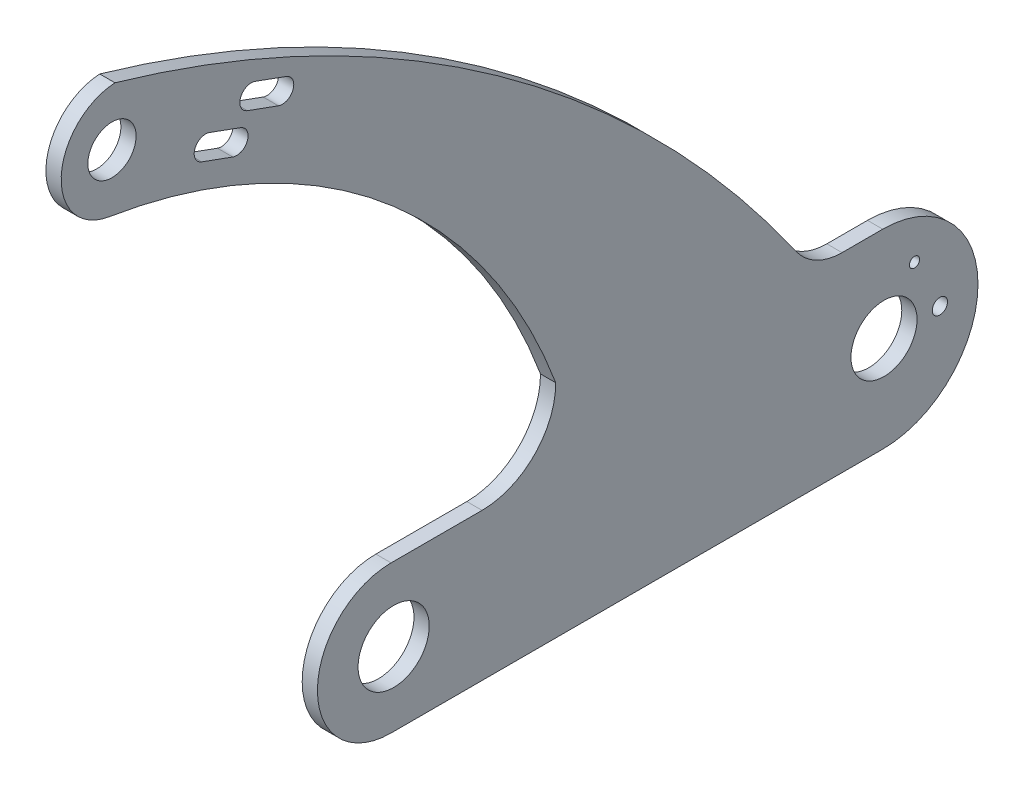
ISO-10303-21;
HEADER;
FILE_DESCRIPTION(('STEP AP214'),'2;1');
FILE_NAME('part.step','',(''),(''),'','','');
FILE_SCHEMA(('AUTOMOTIVE_DESIGN { 1 0 10303 214 1 1 1 1 }'));
ENDSEC;
DATA;
#1=APPLICATION_CONTEXT('core data for automotive mechanical design processes');
#2=APPLICATION_PROTOCOL_DEFINITION('international standard','automotive_design',2000,#1);
#3=PRODUCT_CONTEXT('',#1,'mechanical');
#4=PRODUCT('Part','Part','',(#3));
#5=PRODUCT_RELATED_PRODUCT_CATEGORY('part','',(#4));
#6=PRODUCT_DEFINITION_FORMATION('','',#4);
#7=PRODUCT_DEFINITION_CONTEXT('part definition',#1,'design');
#8=PRODUCT_DEFINITION('design','',#6,#7);
#9=PRODUCT_DEFINITION_SHAPE('','',#8);
#10=(LENGTH_UNIT() NAMED_UNIT(*) SI_UNIT(.MILLI.,.METRE.));
#11=(NAMED_UNIT(*) PLANE_ANGLE_UNIT() SI_UNIT($,.RADIAN.));
#12=(NAMED_UNIT(*) SI_UNIT($,.STERADIAN.) SOLID_ANGLE_UNIT());
#13=UNCERTAINTY_MEASURE_WITH_UNIT(LENGTH_MEASURE(1.E-05),#10,'distance_accuracy_value','');
#14=(GEOMETRIC_REPRESENTATION_CONTEXT(3) GLOBAL_UNCERTAINTY_ASSIGNED_CONTEXT((#13)) GLOBAL_UNIT_ASSIGNED_CONTEXT((#10,
#11,#12)) REPRESENTATION_CONTEXT('',''));
#15=CARTESIAN_POINT('',(0.,0.,0.));
#16=DIRECTION('',(0.,0.,1.));
#17=DIRECTION('',(1.,0.,0.));
#18=AXIS2_PLACEMENT_3D('',#15,#16,#17);
#19=CARTESIAN_POINT('',(3.,14.5,48.375));
#20=DIRECTION('',(-1.,0.,0.));
#21=DIRECTION('',(0.,0.,1.));
#22=AXIS2_PLACEMENT_3D('',#19,#20,#21);
#23=PLANE('',#22);
#24=CARTESIAN_POINT('',(3.,18.75,-48.625));
#25=DIRECTION('',(-1.,0.,0.));
#26=DIRECTION('',(0.,0.,1.));
#27=AXIS2_PLACEMENT_3D('',#24,#25,#26);
#28=CIRCLE('',#27,6.5);
#29=CARTESIAN_POINT('',(3.,18.75,-42.125));
#30=VERTEX_POINT('',#29);
#31=EDGE_CURVE('E202',#30,#30,#28,.T.);
#32=ORIENTED_EDGE('',*,*,#31,.T.);
#33=EDGE_LOOP('',(#32));
#34=FACE_BOUND('',#33,.T.);
#35=CARTESIAN_POINT('',(3.,118.095735365004,84.8817253112062));
#36=DIRECTION('',(1.,0.,0.));
#37=DIRECTION('',(0.,0.,-1.));
#38=AXIS2_PLACEMENT_3D('',#35,#36,#37);
#39=CIRCLE('',#38,2.25000000000001);
#40=CARTESIAN_POINT('',(3.,120.210043761772,84.1121799887234));
#41=VERTEX_POINT('',#40);
#42=CARTESIAN_POINT('',(3.,115.981426968236,85.6512706336889));
#43=VERTEX_POINT('',#42);
#44=EDGE_CURVE('E218',#41,#43,#39,.T.);
#45=ORIENTED_EDGE('',*,*,#44,.F.);
#46=DIRECTION('',(0.,0.342020143325678,0.939692620785905));
#47=VECTOR('',#46,1.);
#48=CARTESIAN_POINT('',(3.,120.210043761772,84.1121799887234));
#49=LINE('',#48,#47);
#50=CARTESIAN_POINT('',(3.,117.986912830155,78.0041779536146));
#51=VERTEX_POINT('',#50);
#52=EDGE_CURVE('E229',#51,#41,#49,.T.);
#53=ORIENTED_EDGE('',*,*,#52,.F.);
#54=CARTESIAN_POINT('',(3.,115.872604433387,78.7737232760973));
#55=DIRECTION('',(1.,0.,0.));
#56=DIRECTION('',(0.,0.,-1.));
#57=AXIS2_PLACEMENT_3D('',#54,#55,#56);
#58=CIRCLE('',#57,2.24999999999998);
#59=CARTESIAN_POINT('',(3.,113.758296036619,79.5432685985799));
#60=VERTEX_POINT('',#59);
#61=EDGE_CURVE('E225',#60,#51,#58,.T.);
#62=ORIENTED_EDGE('',*,*,#61,.F.);
#63=DIRECTION('',(0.,-0.342020143325671,-0.939692620785908));
#64=VECTOR('',#63,1.);
#65=CARTESIAN_POINT('',(3.,115.981426968236,85.6512706336889));
#66=LINE('',#65,#64);
#67=EDGE_CURVE('E221',#43,#60,#66,.T.);
#68=ORIENTED_EDGE('',*,*,#67,.F.);
#69=EDGE_LOOP('',(#45,#53,#62,#68));
#70=FACE_BOUND('',#69,.T.);
#71=CARTESIAN_POINT('',(3.,18.75,-59.625));
#72=DIRECTION('',(1.,0.,0.));
#73=DIRECTION('',(0.,0.,-1.));
#74=AXIS2_PLACEMENT_3D('',#71,#72,#73);
#75=CIRCLE('',#74,1.5);
#76=CARTESIAN_POINT('',(3.,18.75,-61.125));
#77=VERTEX_POINT('',#76);
#78=EDGE_CURVE('E285',#77,#77,#75,.T.);
#79=ORIENTED_EDGE('',*,*,#78,.F.);
#80=EDGE_LOOP('',(#79));
#81=FACE_BOUND('',#80,.T.);
#82=CARTESIAN_POINT('',(3.,14.5,48.375));
#83=DIRECTION('',(1.,0.,0.));
#84=DIRECTION('',(0.,0.,1.));
#85=AXIS2_PLACEMENT_3D('',#82,#83,#84);
#86=CIRCLE('',#85,14.5);
#87=CARTESIAN_POINT('',(3.,29.,48.375));
#88=VERTEX_POINT('',#87);
#89=CARTESIAN_POINT('',(3.,0.,48.375));
#90=VERTEX_POINT('',#89);
#91=EDGE_CURVE('E293',#88,#90,#86,.T.);
#92=ORIENTED_EDGE('',*,*,#91,.T.);
#93=DIRECTION('',(0.,0.,-1.));
#94=VECTOR('',#93,1.);
#95=CARTESIAN_POINT('',(3.,0.,48.375));
#96=LINE('',#95,#94);
#97=CARTESIAN_POINT('',(3.,0.,-48.375));
#98=VERTEX_POINT('',#97);
#99=EDGE_CURVE('E297',#90,#98,#96,.T.);
#100=ORIENTED_EDGE('',*,*,#99,.T.);
#101=CARTESIAN_POINT('',(3.,18.75,-48.375));
#102=DIRECTION('',(1.,0.,0.));
#103=DIRECTION('',(0.,0.,1.));
#104=AXIS2_PLACEMENT_3D('',#101,#102,#103);
#105=CIRCLE('',#104,18.75);
#106=CARTESIAN_POINT('',(3.,37.5,-48.375));
#107=VERTEX_POINT('',#106);
#108=EDGE_CURVE('E301',#98,#107,#105,.T.);
#109=ORIENTED_EDGE('',*,*,#108,.T.);
#110=DIRECTION('',(0.,0.,1.));
#111=VECTOR('',#110,1.);
#112=CARTESIAN_POINT('',(3.,37.5,-48.375));
#113=LINE('',#112,#111);
#114=CARTESIAN_POINT('',(3.,37.5,-40.375));
#115=VERTEX_POINT('',#114);
#116=EDGE_CURVE('E304',#107,#115,#113,.T.);
#117=ORIENTED_EDGE('',*,*,#116,.T.);
#118=CARTESIAN_POINT('',(3.,48.5,-40.375));
#119=DIRECTION('',(-1.,0.,0.));
#120=DIRECTION('',(0.,0.,1.));
#121=AXIS2_PLACEMENT_3D('',#118,#119,#120);
#122=CIRCLE('',#121,11.);
#123=CARTESIAN_POINT('',(3.,42.1906592001385,-31.3643275128211));
#124=VERTEX_POINT('',#123);
#125=EDGE_CURVE('E307',#115,#124,#122,.T.);
#126=ORIENTED_EDGE('',*,*,#125,.T.);
#127=CARTESIAN_POINT('',(3.,-99.7246797185502,171.311780890037));
#128=DIRECTION('',(1.,0.,0.));
#129=DIRECTION('',(0.,0.,-1.));
#130=AXIS2_PLACEMENT_3D('',#127,#128,#129);
#131=CIRCLE('',#130,247.42184288727);
#132=CARTESIAN_POINT('',(3.,138.,102.722095146145));
#133=VERTEX_POINT('',#132);
#134=EDGE_CURVE('E310',#124,#133,#131,.T.);
#135=ORIENTED_EDGE('',*,*,#134,.T.);
#136=CARTESIAN_POINT('',(3.,126.801633622701,102.0911827153));
#137=DIRECTION('',(1.,0.,0.));
#138=DIRECTION('',(0.,0.,-1.));
#139=AXIS2_PLACEMENT_3D('',#136,#137,#138);
#140=CIRCLE('',#139,11.216125);
#141=CARTESIAN_POINT('',(3.,115.730561374973,103.889186970363));
#142=VERTEX_POINT('',#141);
#143=EDGE_CURVE('E313',#133,#142,#140,.T.);
#144=ORIENTED_EDGE('',*,*,#143,.T.);
#145=CARTESIAN_POINT('',(3.,4.03485944329796,122.029195711299));
#146=DIRECTION('',(-1.,0.,0.));
#147=DIRECTION('',(0.,0.,1.));
#148=AXIS2_PLACEMENT_3D('',#145,#146,#147);
#149=CIRCLE('',#148,113.159134616393);
#150=CARTESIAN_POINT('',(3.,43.5,15.975));
#151=VERTEX_POINT('',#150);
#152=EDGE_CURVE('E316',#142,#151,#149,.T.);
#153=ORIENTED_EDGE('',*,*,#152,.T.);
#154=CARTESIAN_POINT('',(3.,43.5,30.475));
#155=DIRECTION('',(-1.,0.,0.));
#156=DIRECTION('',(0.,0.,1.));
#157=AXIS2_PLACEMENT_3D('',#154,#155,#156);
#158=CIRCLE('',#157,14.5);
#159=CARTESIAN_POINT('',(3.,29.,30.475));
#160=VERTEX_POINT('',#159);
#161=EDGE_CURVE('E319',#151,#160,#158,.T.);
#162=ORIENTED_EDGE('',*,*,#161,.T.);
#163=DIRECTION('',(0.,0.,1.));
#164=VECTOR('',#163,1.);
#165=CARTESIAN_POINT('',(3.,29.,48.375));
#166=LINE('',#165,#164);
#167=EDGE_CURVE('E322',#160,#88,#166,.T.);
#168=ORIENTED_EDGE('',*,*,#167,.T.);
#169=EDGE_LOOP('',(#92,#100,#109,#117,#126,#135,#144,#153,#162,#168));
#170=FACE_BOUND('',#169,.T.);
#171=CARTESIAN_POINT('',(3.,28.75,-54.625));
#172=DIRECTION('',(1.,0.,0.));
#173=DIRECTION('',(0.,0.,-1.));
#174=AXIS2_PLACEMENT_3D('',#171,#172,#173);
#175=CIRCLE('',#174,0.999999999999998);
#176=CARTESIAN_POINT('',(3.,28.75,-55.625));
#177=VERTEX_POINT('',#176);
#178=EDGE_CURVE('E277',#177,#177,#175,.T.);
#179=ORIENTED_EDGE('',*,*,#178,.F.);
#180=EDGE_LOOP('',(#179));
#181=FACE_BOUND('',#180,.T.);
#182=CARTESIAN_POINT('',(3.,14.5,47.875));
#183=DIRECTION('',(1.,0.,0.));
#184=DIRECTION('',(0.,0.,-1.));
#185=AXIS2_PLACEMENT_3D('',#182,#183,#184);
#186=CIRCLE('',#185,7.);
#187=CARTESIAN_POINT('',(3.,14.5,40.875));
#188=VERTEX_POINT('',#187);
#189=EDGE_CURVE('E269',#188,#188,#186,.T.);
#190=ORIENTED_EDGE('',*,*,#189,.F.);
#191=EDGE_LOOP('',(#190));
#192=FACE_BOUND('',#191,.T.);
#193=CARTESIAN_POINT('',(3.,126.865280687486,103.305641058254));
#194=DIRECTION('',(1.,0.,0.));
#195=DIRECTION('',(0.,0.,-1.));
#196=AXIS2_PLACEMENT_3D('',#193,#194,#195);
#197=CIRCLE('',#196,4.75000000000001);
#198=CARTESIAN_POINT('',(3.,126.865280687486,98.5556410582536));
#199=VERTEX_POINT('',#198);
#200=EDGE_CURVE('E261',#199,#199,#197,.T.);
#201=ORIENTED_EDGE('',*,*,#200,.F.);
#202=EDGE_LOOP('',(#201));
#203=FACE_BOUND('',#202,.T.);
#204=CARTESIAN_POINT('',(3.,122.32435215854,75.8898695568463));
#205=DIRECTION('',(1.,0.,0.));
#206=DIRECTION('',(0.,0.,-1.));
#207=AXIS2_PLACEMENT_3D('',#204,#205,#206);
#208=CIRCLE('',#207,2.24999999999995);
#209=CARTESIAN_POINT('',(3.,124.438660555309,75.1203242343635));
#210=VERTEX_POINT('',#209);
#211=CARTESIAN_POINT('',(3.,120.210043761772,76.6594148793291));
#212=VERTEX_POINT('',#211);
#213=EDGE_CURVE('E168',#210,#212,#208,.T.);
#214=ORIENTED_EDGE('',*,*,#213,.F.);
#215=DIRECTION('',(0.,0.34202014332567,0.939692620785908));
#216=VECTOR('',#215,1.);
#217=CARTESIAN_POINT('',(3.,124.438660555309,75.1203242343635));
#218=LINE('',#217,#216);
#219=CARTESIAN_POINT('',(3.,122.215529623692,69.0123221992552));
#220=VERTEX_POINT('',#219);
#221=EDGE_CURVE('E194',#220,#210,#218,.T.);
#222=ORIENTED_EDGE('',*,*,#221,.F.);
#223=CARTESIAN_POINT('',(3.,120.101221226923,69.7818675217379));
#224=DIRECTION('',(1.,0.,0.));
#225=DIRECTION('',(0.,0.,-1.));
#226=AXIS2_PLACEMENT_3D('',#223,#224,#225);
#227=CIRCLE('',#226,2.24999999999998);
#228=CARTESIAN_POINT('',(3.,117.986912830155,70.5514128442207));
#229=VERTEX_POINT('',#228);
#230=EDGE_CURVE('E190',#229,#220,#227,.T.);
#231=ORIENTED_EDGE('',*,*,#230,.F.);
#232=DIRECTION('',(0.,-0.342020143325676,-0.939692620785906));
#233=VECTOR('',#232,1.);
#234=CARTESIAN_POINT('',(3.,120.210043761772,76.6594148793291));
#235=LINE('',#234,#233);
#236=EDGE_CURVE('E177',#212,#229,#235,.T.);
#237=ORIENTED_EDGE('',*,*,#236,.F.);
#238=EDGE_LOOP('',(#214,#222,#231,#237));
#239=FACE_BOUND('',#238,.T.);
#240=ADVANCED_FACE('F42',(#34,#70,#81,#170,#181,#192,#203,#239),#23,.F.);
#241=CARTESIAN_POINT('',(0.,14.5,48.375));
#242=DIRECTION('',(-1.,0.,0.));
#243=DIRECTION('',(0.,0.,1.));
#244=AXIS2_PLACEMENT_3D('',#241,#242,#243);
#245=PLANE('',#244);
#246=CARTESIAN_POINT('',(0.,18.75,-48.625));
#247=DIRECTION('',(1.,0.,0.));
#248=DIRECTION('',(0.,0.,-1.));
#249=AXIS2_PLACEMENT_3D('',#246,#247,#248);
#250=CIRCLE('',#249,6.5);
#251=CARTESIAN_POINT('',(0.,18.75,-55.125));
#252=VERTEX_POINT('',#251);
#253=EDGE_CURVE('E716',#252,#252,#250,.T.);
#254=ORIENTED_EDGE('',*,*,#253,.T.);
#255=EDGE_LOOP('',(#254));
#256=FACE_BOUND('',#255,.T.);
#257=CARTESIAN_POINT('',(0.,14.5,47.875));
#258=DIRECTION('',(1.,0.,0.));
#259=DIRECTION('',(0.,0.,-1.));
#260=AXIS2_PLACEMENT_3D('',#257,#258,#259);
#261=CIRCLE('',#260,7.);
#262=CARTESIAN_POINT('',(0.,14.5,40.875));
#263=VERTEX_POINT('',#262);
#264=EDGE_CURVE('E265',#263,#263,#261,.T.);
#265=ORIENTED_EDGE('',*,*,#264,.T.);
#266=EDGE_LOOP('',(#265));
#267=FACE_BOUND('',#266,.T.);
#268=CARTESIAN_POINT('',(0.,18.75,-59.625));
#269=DIRECTION('',(1.,0.,0.));
#270=DIRECTION('',(0.,0.,-1.));
#271=AXIS2_PLACEMENT_3D('',#268,#269,#270);
#272=CIRCLE('',#271,1.5);
#273=CARTESIAN_POINT('',(0.,18.75,-61.125));
#274=VERTEX_POINT('',#273);
#275=EDGE_CURVE('E281',#274,#274,#272,.T.);
#276=ORIENTED_EDGE('',*,*,#275,.T.);
#277=EDGE_LOOP('',(#276));
#278=FACE_BOUND('',#277,.T.);
#279=CARTESIAN_POINT('',(0.,14.5,48.375));
#280=DIRECTION('',(1.,0.,0.));
#281=DIRECTION('',(0.,0.,1.));
#282=AXIS2_PLACEMENT_3D('',#279,#280,#281);
#283=CIRCLE('',#282,14.5);
#284=CARTESIAN_POINT('',(0.,29.,48.375));
#285=VERTEX_POINT('',#284);
#286=CARTESIAN_POINT('',(0.,0.,48.375));
#287=VERTEX_POINT('',#286);
#288=EDGE_CURVE('E289',#285,#287,#283,.T.);
#289=ORIENTED_EDGE('',*,*,#288,.F.);
#290=DIRECTION('',(0.,0.,1.));
#291=VECTOR('',#290,1.);
#292=CARTESIAN_POINT('',(0.,29.,48.375));
#293=LINE('',#292,#291);
#294=CARTESIAN_POINT('',(0.,29.,30.475));
#295=VERTEX_POINT('',#294);
#296=EDGE_CURVE('E298',#295,#285,#293,.T.);
#297=ORIENTED_EDGE('',*,*,#296,.F.);
#298=CARTESIAN_POINT('',(0.,43.5,30.475));
#299=DIRECTION('',(-1.,0.,0.));
#300=DIRECTION('',(0.,0.,1.));
#301=AXIS2_PLACEMENT_3D('',#298,#299,#300);
#302=CIRCLE('',#301,14.5);
#303=CARTESIAN_POINT('',(0.,43.5,15.975));
#304=VERTEX_POINT('',#303);
#305=EDGE_CURVE('E350',#304,#295,#302,.T.);
#306=ORIENTED_EDGE('',*,*,#305,.F.);
#307=CARTESIAN_POINT('',(0.,4.03485944329796,122.029195711299));
#308=DIRECTION('',(-1.,0.,0.));
#309=DIRECTION('',(0.,0.,1.));
#310=AXIS2_PLACEMENT_3D('',#307,#308,#309);
#311=CIRCLE('',#310,113.159134616393);
#312=CARTESIAN_POINT('',(0.,115.730561374973,103.889186970363));
#313=VERTEX_POINT('',#312);
#314=EDGE_CURVE('E347',#313,#304,#311,.T.);
#315=ORIENTED_EDGE('',*,*,#314,.F.);
#316=CARTESIAN_POINT('',(0.,126.801633622701,102.0911827153));
#317=DIRECTION('',(1.,0.,0.));
#318=DIRECTION('',(0.,0.,-1.));
#319=AXIS2_PLACEMENT_3D('',#316,#317,#318);
#320=CIRCLE('',#319,11.216125);
#321=CARTESIAN_POINT('',(0.,138.,102.722095146145));
#322=VERTEX_POINT('',#321);
#323=EDGE_CURVE('E344',#322,#313,#320,.T.);
#324=ORIENTED_EDGE('',*,*,#323,.F.);
#325=CARTESIAN_POINT('',(0.,-99.7246797185502,171.311780890037));
#326=DIRECTION('',(1.,0.,0.));
#327=DIRECTION('',(0.,0.,-1.));
#328=AXIS2_PLACEMENT_3D('',#325,#326,#327);
#329=CIRCLE('',#328,247.42184288727);
#330=CARTESIAN_POINT('',(0.,42.1906592001385,-31.3643275128211));
#331=VERTEX_POINT('',#330);
#332=EDGE_CURVE('E341',#331,#322,#329,.T.);
#333=ORIENTED_EDGE('',*,*,#332,.F.);
#334=CARTESIAN_POINT('',(0.,48.5,-40.375));
#335=DIRECTION('',(-1.,0.,0.));
#336=DIRECTION('',(0.,0.,1.));
#337=AXIS2_PLACEMENT_3D('',#334,#335,#336);
#338=CIRCLE('',#337,11.);
#339=CARTESIAN_POINT('',(0.,37.5,-40.375));
#340=VERTEX_POINT('',#339);
#341=EDGE_CURVE('E338',#340,#331,#338,.T.);
#342=ORIENTED_EDGE('',*,*,#341,.F.);
#343=DIRECTION('',(0.,0.,1.));
#344=VECTOR('',#343,1.);
#345=CARTESIAN_POINT('',(0.,37.5,-48.375));
#346=LINE('',#345,#344);
#347=CARTESIAN_POINT('',(0.,37.5,-48.375));
#348=VERTEX_POINT('',#347);
#349=EDGE_CURVE('E335',#348,#340,#346,.T.);
#350=ORIENTED_EDGE('',*,*,#349,.F.);
#351=CARTESIAN_POINT('',(0.,18.75,-48.375));
#352=DIRECTION('',(1.,0.,0.));
#353=DIRECTION('',(0.,0.,1.));
#354=AXIS2_PLACEMENT_3D('',#351,#352,#353);
#355=CIRCLE('',#354,18.75);
#356=CARTESIAN_POINT('',(0.,0.,-48.375));
#357=VERTEX_POINT('',#356);
#358=EDGE_CURVE('E332',#357,#348,#355,.T.);
#359=ORIENTED_EDGE('',*,*,#358,.F.);
#360=DIRECTION('',(0.,0.,-1.));
#361=VECTOR('',#360,1.);
#362=CARTESIAN_POINT('',(0.,0.,48.375));
#363=LINE('',#362,#361);
#364=EDGE_CURVE('E329',#287,#357,#363,.T.);
#365=ORIENTED_EDGE('',*,*,#364,.F.);
#366=EDGE_LOOP('',(#289,#297,#306,#315,#324,#333,#342,#350,#359,#365));
#367=FACE_BOUND('',#366,.T.);
#368=CARTESIAN_POINT('',(0.,28.75,-54.625));
#369=DIRECTION('',(1.,0.,0.));
#370=DIRECTION('',(0.,0.,-1.));
#371=AXIS2_PLACEMENT_3D('',#368,#369,#370);
#372=CIRCLE('',#371,0.999999999999998);
#373=CARTESIAN_POINT('',(0.,28.75,-55.625));
#374=VERTEX_POINT('',#373);
#375=EDGE_CURVE('E273',#374,#374,#372,.T.);
#376=ORIENTED_EDGE('',*,*,#375,.T.);
#377=EDGE_LOOP('',(#376));
#378=FACE_BOUND('',#377,.T.);
#379=CARTESIAN_POINT('',(0.,126.865280687486,103.305641058254));
#380=DIRECTION('',(1.,0.,0.));
#381=DIRECTION('',(0.,0.,-1.));
#382=AXIS2_PLACEMENT_3D('',#379,#380,#381);
#383=CIRCLE('',#382,4.75000000000001);
#384=CARTESIAN_POINT('',(0.,126.865280687486,98.5556410582536));
#385=VERTEX_POINT('',#384);
#386=EDGE_CURVE('E260',#385,#385,#383,.T.);
#387=ORIENTED_EDGE('',*,*,#386,.T.);
#388=EDGE_LOOP('',(#387));
#389=FACE_BOUND('',#388,.T.);
#390=DIRECTION('',(0.,0.342020143325678,0.939692620785905));
#391=VECTOR('',#390,1.);
#392=CARTESIAN_POINT('',(0.,120.210043761772,84.1121799887234));
#393=LINE('',#392,#391);
#394=CARTESIAN_POINT('',(0.,117.986912830155,78.0041779536146));
#395=VERTEX_POINT('',#394);
#396=CARTESIAN_POINT('',(0.,120.210043761772,84.1121799887234));
#397=VERTEX_POINT('',#396);
#398=EDGE_CURVE('E222',#395,#397,#393,.T.);
#399=ORIENTED_EDGE('',*,*,#398,.T.);
#400=CARTESIAN_POINT('',(0.,118.095735365004,84.8817253112062));
#401=DIRECTION('',(1.,0.,0.));
#402=DIRECTION('',(0.,0.,-1.));
#403=AXIS2_PLACEMENT_3D('',#400,#401,#402);
#404=CIRCLE('',#403,2.25000000000001);
#405=CARTESIAN_POINT('',(0.,115.981426968236,85.6512706336889));
#406=VERTEX_POINT('',#405);
#407=EDGE_CURVE('E186',#397,#406,#404,.T.);
#408=ORIENTED_EDGE('',*,*,#407,.T.);
#409=DIRECTION('',(0.,-0.342020143325671,-0.939692620785908));
#410=VECTOR('',#409,1.);
#411=CARTESIAN_POINT('',(0.,115.981426968236,85.6512706336889));
#412=LINE('',#411,#410);
#413=CARTESIAN_POINT('',(0.,113.758296036619,79.5432685985799));
#414=VERTEX_POINT('',#413);
#415=EDGE_CURVE('E236',#406,#414,#412,.T.);
#416=ORIENTED_EDGE('',*,*,#415,.T.);
#417=CARTESIAN_POINT('',(0.,115.872604433387,78.7737232760973));
#418=DIRECTION('',(1.,0.,0.));
#419=DIRECTION('',(0.,0.,-1.));
#420=AXIS2_PLACEMENT_3D('',#417,#418,#419);
#421=CIRCLE('',#420,2.24999999999998);
#422=EDGE_CURVE('E240',#414,#395,#421,.T.);
#423=ORIENTED_EDGE('',*,*,#422,.T.);
#424=EDGE_LOOP('',(#399,#408,#416,#423));
#425=FACE_BOUND('',#424,.T.);
#426=DIRECTION('',(0.,0.34202014332567,0.939692620785908));
#427=VECTOR('',#426,1.);
#428=CARTESIAN_POINT('',(0.,124.438660555309,75.1203242343635));
#429=LINE('',#428,#427);
#430=CARTESIAN_POINT('',(0.,122.215529623692,69.0123221992552));
#431=VERTEX_POINT('',#430);
#432=CARTESIAN_POINT('',(0.,124.438660555309,75.1203242343635));
#433=VERTEX_POINT('',#432);
#434=EDGE_CURVE('E178',#431,#433,#429,.T.);
#435=ORIENTED_EDGE('',*,*,#434,.T.);
#436=CARTESIAN_POINT('',(0.,122.32435215854,75.8898695568463));
#437=DIRECTION('',(1.,0.,0.));
#438=DIRECTION('',(0.,0.,-1.));
#439=AXIS2_PLACEMENT_3D('',#436,#437,#438);
#440=CIRCLE('',#439,2.24999999999995);
#441=CARTESIAN_POINT('',(0.,120.210043761772,76.6594148793291));
#442=VERTEX_POINT('',#441);
#443=EDGE_CURVE('E66',#433,#442,#440,.T.);
#444=ORIENTED_EDGE('',*,*,#443,.T.);
#445=DIRECTION('',(0.,-0.342020143325676,-0.939692620785906));
#446=VECTOR('',#445,1.);
#447=CARTESIAN_POINT('',(0.,120.210043761772,76.6594148793291));
#448=LINE('',#447,#446);
#449=CARTESIAN_POINT('',(0.,117.986912830155,70.5514128442207));
#450=VERTEX_POINT('',#449);
#451=EDGE_CURVE('E184',#442,#450,#448,.T.);
#452=ORIENTED_EDGE('',*,*,#451,.T.);
#453=CARTESIAN_POINT('',(0.,120.101221226923,69.7818675217379));
#454=DIRECTION('',(1.,0.,0.));
#455=DIRECTION('',(0.,0.,-1.));
#456=AXIS2_PLACEMENT_3D('',#453,#454,#455);
#457=CIRCLE('',#456,2.24999999999998);
#458=EDGE_CURVE('E205',#450,#431,#457,.T.);
#459=ORIENTED_EDGE('',*,*,#458,.T.);
#460=EDGE_LOOP('',(#435,#444,#452,#459));
#461=FACE_BOUND('',#460,.T.);
#462=ADVANCED_FACE('F397',(#256,#267,#278,#367,#378,#389,#425,#461),#245,.T.);
#463=CARTESIAN_POINT('',(3.,14.5,48.375));
#464=DIRECTION('',(-1.,0.,0.));
#465=DIRECTION('',(0.,0.,1.));
#466=AXIS2_PLACEMENT_3D('',#463,#464,#465);
#467=CYLINDRICAL_SURFACE('',#466,14.5);
#468=ORIENTED_EDGE('',*,*,#288,.T.);
#469=DIRECTION('',(-1.,0.,0.));
#470=VECTOR('',#469,1.);
#471=CARTESIAN_POINT('',(3.,0.,48.375));
#472=LINE('',#471,#470);
#473=EDGE_CURVE('E11',#90,#287,#472,.T.);
#474=ORIENTED_EDGE('',*,*,#473,.F.);
#475=ORIENTED_EDGE('',*,*,#91,.F.);
#476=DIRECTION('',(-1.,0.,0.));
#477=VECTOR('',#476,1.);
#478=CARTESIAN_POINT('',(3.,29.,48.375));
#479=LINE('',#478,#477);
#480=EDGE_CURVE('E325',#88,#285,#479,.T.);
#481=ORIENTED_EDGE('',*,*,#480,.T.);
#482=EDGE_LOOP('',(#468,#474,#475,#481));
#483=FACE_BOUND('',#482,.T.);
#484=ADVANCED_FACE('F44',(#483),#467,.T.);
#485=CARTESIAN_POINT('',(3.,0.,48.375));
#486=DIRECTION('',(0.,1.,0.));
#487=DIRECTION('',(0.,0.,1.));
#488=AXIS2_PLACEMENT_3D('',#485,#486,#487);
#489=PLANE('',#488);
#490=ORIENTED_EDGE('',*,*,#364,.T.);
#491=DIRECTION('',(-1.,0.,0.));
#492=VECTOR('',#491,1.);
#493=CARTESIAN_POINT('',(3.,0.,-48.375));
#494=LINE('',#493,#492);
#495=EDGE_CURVE('E51',#98,#357,#494,.T.);
#496=ORIENTED_EDGE('',*,*,#495,.F.);
#497=ORIENTED_EDGE('',*,*,#99,.F.);
#498=ORIENTED_EDGE('',*,*,#473,.T.);
#499=EDGE_LOOP('',(#490,#496,#497,#498));
#500=FACE_BOUND('',#499,.T.);
#501=ADVANCED_FACE('F415',(#500),#489,.F.);
#502=CARTESIAN_POINT('',(3.,18.75,-48.375));
#503=DIRECTION('',(-1.,0.,0.));
#504=DIRECTION('',(0.,0.,1.));
#505=AXIS2_PLACEMENT_3D('',#502,#503,#504);
#506=CYLINDRICAL_SURFACE('',#505,18.75);
#507=ORIENTED_EDGE('',*,*,#358,.T.);
#508=DIRECTION('',(-1.,0.,0.));
#509=VECTOR('',#508,1.);
#510=CARTESIAN_POINT('',(3.,37.5,-48.375));
#511=LINE('',#510,#509);
#512=EDGE_CURVE('E382',#107,#348,#511,.T.);
#513=ORIENTED_EDGE('',*,*,#512,.F.);
#514=ORIENTED_EDGE('',*,*,#108,.F.);
#515=ORIENTED_EDGE('',*,*,#495,.T.);
#516=EDGE_LOOP('',(#507,#513,#514,#515));
#517=FACE_BOUND('',#516,.T.);
#518=ADVANCED_FACE('F391',(#517),#506,.T.);
#519=CARTESIAN_POINT('',(3.,37.5,-48.375));
#520=DIRECTION('',(0.,-1.,0.));
#521=DIRECTION('',(0.,0.,-1.));
#522=AXIS2_PLACEMENT_3D('',#519,#520,#521);
#523=PLANE('',#522);
#524=ORIENTED_EDGE('',*,*,#349,.T.);
#525=DIRECTION('',(-1.,0.,0.));
#526=VECTOR('',#525,1.);
#527=CARTESIAN_POINT('',(3.,37.5,-40.375));
#528=LINE('',#527,#526);
#529=EDGE_CURVE('E378',#115,#340,#528,.T.);
#530=ORIENTED_EDGE('',*,*,#529,.F.);
#531=ORIENTED_EDGE('',*,*,#116,.F.);
#532=ORIENTED_EDGE('',*,*,#512,.T.);
#533=EDGE_LOOP('',(#524,#530,#531,#532));
#534=FACE_BOUND('',#533,.T.);
#535=ADVANCED_FACE('F403',(#534),#523,.F.);
#536=CARTESIAN_POINT('',(3.,48.5,-40.375));
#537=DIRECTION('',(-1.,0.,0.));
#538=DIRECTION('',(0.,0.,1.));
#539=AXIS2_PLACEMENT_3D('',#536,#537,#538);
#540=CYLINDRICAL_SURFACE('',#539,11.);
#541=ORIENTED_EDGE('',*,*,#341,.T.);
#542=DIRECTION('',(-1.,0.,0.));
#543=VECTOR('',#542,1.);
#544=CARTESIAN_POINT('',(3.,42.1906592001385,-31.3643275128211));
#545=LINE('',#544,#543);
#546=EDGE_CURVE('E374',#124,#331,#545,.T.);
#547=ORIENTED_EDGE('',*,*,#546,.F.);
#548=ORIENTED_EDGE('',*,*,#125,.F.);
#549=ORIENTED_EDGE('',*,*,#529,.T.);
#550=EDGE_LOOP('',(#541,#547,#548,#549));
#551=FACE_BOUND('',#550,.T.);
#552=ADVANCED_FACE('F407',(#551),#540,.F.);
#553=CARTESIAN_POINT('',(3.,-99.7246797185502,171.311780890037));
#554=DIRECTION('',(-1.,0.,0.));
#555=DIRECTION('',(0.,0.,1.));
#556=AXIS2_PLACEMENT_3D('',#553,#554,#555);
#557=CYLINDRICAL_SURFACE('',#556,247.42184288727);
#558=ORIENTED_EDGE('',*,*,#332,.T.);
#559=DIRECTION('',(-1.,0.,0.));
#560=VECTOR('',#559,1.);
#561=CARTESIAN_POINT('',(3.,138.,102.722095146145));
#562=LINE('',#561,#560);
#563=EDGE_CURVE('E370',#133,#322,#562,.T.);
#564=ORIENTED_EDGE('',*,*,#563,.F.);
#565=ORIENTED_EDGE('',*,*,#134,.F.);
#566=ORIENTED_EDGE('',*,*,#546,.T.);
#567=EDGE_LOOP('',(#558,#564,#565,#566));
#568=FACE_BOUND('',#567,.T.);
#569=ADVANCED_FACE('F438',(#568),#557,.T.);
#570=CARTESIAN_POINT('',(3.,126.801633622701,102.0911827153));
#571=DIRECTION('',(-1.,0.,0.));
#572=DIRECTION('',(0.,0.,1.));
#573=AXIS2_PLACEMENT_3D('',#570,#571,#572);
#574=CYLINDRICAL_SURFACE('',#573,11.216125);
#575=ORIENTED_EDGE('',*,*,#323,.T.);
#576=DIRECTION('',(-1.,0.,0.));
#577=VECTOR('',#576,1.);
#578=CARTESIAN_POINT('',(3.,115.730561374973,103.889186970363));
#579=LINE('',#578,#577);
#580=EDGE_CURVE('E366',#142,#313,#579,.T.);
#581=ORIENTED_EDGE('',*,*,#580,.F.);
#582=ORIENTED_EDGE('',*,*,#143,.F.);
#583=ORIENTED_EDGE('',*,*,#563,.T.);
#584=EDGE_LOOP('',(#575,#581,#582,#583));
#585=FACE_BOUND('',#584,.T.);
#586=ADVANCED_FACE('F435',(#585),#574,.T.);
#587=CARTESIAN_POINT('',(3.,4.03485944329796,122.029195711299));
#588=DIRECTION('',(-1.,0.,0.));
#589=DIRECTION('',(0.,0.,1.));
#590=AXIS2_PLACEMENT_3D('',#587,#588,#589);
#591=CYLINDRICAL_SURFACE('',#590,113.159134616393);
#592=ORIENTED_EDGE('',*,*,#314,.T.);
#593=DIRECTION('',(-1.,0.,0.));
#594=VECTOR('',#593,1.);
#595=CARTESIAN_POINT('',(3.,43.5,15.975));
#596=LINE('',#595,#594);
#597=EDGE_CURVE('E362',#151,#304,#596,.T.);
#598=ORIENTED_EDGE('',*,*,#597,.F.);
#599=ORIENTED_EDGE('',*,*,#152,.F.);
#600=ORIENTED_EDGE('',*,*,#580,.T.);
#601=EDGE_LOOP('',(#592,#598,#599,#600));
#602=FACE_BOUND('',#601,.T.);
#603=ADVANCED_FACE('F431',(#602),#591,.F.);
#604=CARTESIAN_POINT('',(3.,43.5,30.475));
#605=DIRECTION('',(-1.,0.,0.));
#606=DIRECTION('',(0.,0.,1.));
#607=AXIS2_PLACEMENT_3D('',#604,#605,#606);
#608=CYLINDRICAL_SURFACE('',#607,14.5);
#609=ORIENTED_EDGE('',*,*,#305,.T.);
#610=DIRECTION('',(-1.,0.,0.));
#611=VECTOR('',#610,1.);
#612=CARTESIAN_POINT('',(3.,29.,30.475));
#613=LINE('',#612,#611);
#614=EDGE_CURVE('E358',#160,#295,#613,.T.);
#615=ORIENTED_EDGE('',*,*,#614,.F.);
#616=ORIENTED_EDGE('',*,*,#161,.F.);
#617=ORIENTED_EDGE('',*,*,#597,.T.);
#618=EDGE_LOOP('',(#609,#615,#616,#617));
#619=FACE_BOUND('',#618,.T.);
#620=ADVANCED_FACE('F427',(#619),#608,.F.);
#621=CARTESIAN_POINT('',(3.,29.,48.375));
#622=DIRECTION('',(0.,-1.,0.));
#623=DIRECTION('',(0.,0.,-1.));
#624=AXIS2_PLACEMENT_3D('',#621,#622,#623);
#625=PLANE('',#624);
#626=ORIENTED_EDGE('',*,*,#296,.T.);
#627=ORIENTED_EDGE('',*,*,#480,.F.);
#628=ORIENTED_EDGE('',*,*,#167,.F.);
#629=ORIENTED_EDGE('',*,*,#614,.T.);
#630=EDGE_LOOP('',(#626,#627,#628,#629));
#631=FACE_BOUND('',#630,.T.);
#632=ADVANCED_FACE('F422',(#631),#625,.F.);
#633=CARTESIAN_POINT('',(3.,18.75,-59.625));
#634=DIRECTION('',(-1.,0.,0.));
#635=DIRECTION('',(0.,0.,1.));
#636=AXIS2_PLACEMENT_3D('',#633,#634,#635);
#637=CYLINDRICAL_SURFACE('',#636,1.5);
#638=ORIENTED_EDGE('',*,*,#78,.T.);
#639=EDGE_LOOP('',(#638));
#640=FACE_BOUND('',#639,.T.);
#641=ORIENTED_EDGE('',*,*,#275,.F.);
#642=EDGE_LOOP('',(#641));
#643=FACE_BOUND('',#642,.T.);
#644=ADVANCED_FACE('F458',(#640,#643),#637,.F.);
#645=CARTESIAN_POINT('',(3.,28.75,-54.625));
#646=DIRECTION('',(-1.,0.,0.));
#647=DIRECTION('',(0.,0.,1.));
#648=AXIS2_PLACEMENT_3D('',#645,#646,#647);
#649=CYLINDRICAL_SURFACE('',#648,0.999999999999998);
#650=ORIENTED_EDGE('',*,*,#178,.T.);
#651=EDGE_LOOP('',(#650));
#652=FACE_BOUND('',#651,.T.);
#653=ORIENTED_EDGE('',*,*,#375,.F.);
#654=EDGE_LOOP('',(#653));
#655=FACE_BOUND('',#654,.T.);
#656=ADVANCED_FACE('F484',(#652,#655),#649,.F.);
#657=CARTESIAN_POINT('',(3.,14.5,47.875));
#658=DIRECTION('',(-1.,0.,0.));
#659=DIRECTION('',(0.,0.,1.));
#660=AXIS2_PLACEMENT_3D('',#657,#658,#659);
#661=CYLINDRICAL_SURFACE('',#660,7.);
#662=ORIENTED_EDGE('',*,*,#189,.T.);
#663=EDGE_LOOP('',(#662));
#664=FACE_BOUND('',#663,.T.);
#665=ORIENTED_EDGE('',*,*,#264,.F.);
#666=EDGE_LOOP('',(#665));
#667=FACE_BOUND('',#666,.T.);
#668=ADVANCED_FACE('F491',(#664,#667),#661,.F.);
#669=CARTESIAN_POINT('',(3.,126.865280687486,103.305641058254));
#670=DIRECTION('',(-1.,0.,0.));
#671=DIRECTION('',(0.,0.,1.));
#672=AXIS2_PLACEMENT_3D('',#669,#670,#671);
#673=CYLINDRICAL_SURFACE('',#672,4.75000000000001);
#674=ORIENTED_EDGE('',*,*,#200,.T.);
#675=EDGE_LOOP('',(#674));
#676=FACE_BOUND('',#675,.T.);
#677=ORIENTED_EDGE('',*,*,#386,.F.);
#678=EDGE_LOOP('',(#677));
#679=FACE_BOUND('',#678,.T.);
#680=ADVANCED_FACE('F498',(#676,#679),#673,.F.);
#681=CARTESIAN_POINT('',(3.,118.095735365004,84.8817253112062));
#682=DIRECTION('',(-1.,0.,0.));
#683=DIRECTION('',(0.,0.,1.));
#684=AXIS2_PLACEMENT_3D('',#681,#682,#683);
#685=CYLINDRICAL_SURFACE('',#684,2.25000000000001);
#686=ORIENTED_EDGE('',*,*,#407,.F.);
#687=DIRECTION('',(-1.,0.,0.));
#688=VECTOR('',#687,1.);
#689=CARTESIAN_POINT('',(3.,120.210043761772,84.1121799887234));
#690=LINE('',#689,#688);
#691=EDGE_CURVE('E232',#41,#397,#690,.T.);
#692=ORIENTED_EDGE('',*,*,#691,.F.);
#693=ORIENTED_EDGE('',*,*,#44,.T.);
#694=DIRECTION('',(-1.,0.,0.));
#695=VECTOR('',#694,1.);
#696=CARTESIAN_POINT('',(3.,115.981426968236,85.6512706336889));
#697=LINE('',#696,#695);
#698=EDGE_CURVE('E256',#43,#406,#697,.T.);
#699=ORIENTED_EDGE('',*,*,#698,.T.);
#700=EDGE_LOOP('',(#686,#692,#693,#699));
#701=FACE_BOUND('',#700,.T.);
#702=ADVANCED_FACE('F506',(#701),#685,.F.);
#703=CARTESIAN_POINT('',(3.,115.981426968236,85.6512706336889));
#704=DIRECTION('',(0.,0.939692620785908,-0.342020143325671));
#705=DIRECTION('',(0.,0.342020143325671,0.939692620785908));
#706=AXIS2_PLACEMENT_3D('',#703,#704,#705);
#707=PLANE('',#706);
#708=ORIENTED_EDGE('',*,*,#415,.F.);
#709=ORIENTED_EDGE('',*,*,#698,.F.);
#710=ORIENTED_EDGE('',*,*,#67,.T.);
#711=DIRECTION('',(-1.,0.,0.));
#712=VECTOR('',#711,1.);
#713=CARTESIAN_POINT('',(3.,113.758296036619,79.5432685985799));
#714=LINE('',#713,#712);
#715=EDGE_CURVE('E253',#60,#414,#714,.T.);
#716=ORIENTED_EDGE('',*,*,#715,.T.);
#717=EDGE_LOOP('',(#708,#709,#710,#716));
#718=FACE_BOUND('',#717,.T.);
#719=ADVANCED_FACE('F514',(#718),#707,.T.);
#720=CARTESIAN_POINT('',(3.,115.872604433387,78.7737232760973));
#721=DIRECTION('',(-1.,0.,0.));
#722=DIRECTION('',(0.,0.,1.));
#723=AXIS2_PLACEMENT_3D('',#720,#721,#722);
#724=CYLINDRICAL_SURFACE('',#723,2.24999999999998);
#725=ORIENTED_EDGE('',*,*,#422,.F.);
#726=ORIENTED_EDGE('',*,*,#715,.F.);
#727=ORIENTED_EDGE('',*,*,#61,.T.);
#728=DIRECTION('',(-1.,0.,0.));
#729=VECTOR('',#728,1.);
#730=CARTESIAN_POINT('',(3.,117.986912830155,78.0041779536146));
#731=LINE('',#730,#729);
#732=EDGE_CURVE('E250',#51,#395,#731,.T.);
#733=ORIENTED_EDGE('',*,*,#732,.T.);
#734=EDGE_LOOP('',(#725,#726,#727,#733));
#735=FACE_BOUND('',#734,.T.);
#736=ADVANCED_FACE('F522',(#735),#724,.F.);
#737=CARTESIAN_POINT('',(3.,120.210043761772,84.1121799887234));
#738=DIRECTION('',(0.,-0.939692620785905,0.342020143325678));
#739=DIRECTION('',(0.,-0.342020143325678,-0.939692620785905));
#740=AXIS2_PLACEMENT_3D('',#737,#738,#739);
#741=PLANE('',#740);
#742=ORIENTED_EDGE('',*,*,#398,.F.);
#743=ORIENTED_EDGE('',*,*,#732,.F.);
#744=ORIENTED_EDGE('',*,*,#52,.T.);
#745=ORIENTED_EDGE('',*,*,#691,.T.);
#746=EDGE_LOOP('',(#742,#743,#744,#745));
#747=FACE_BOUND('',#746,.T.);
#748=ADVANCED_FACE('F530',(#747),#741,.T.);
#749=CARTESIAN_POINT('',(3.,122.32435215854,75.8898695568463));
#750=DIRECTION('',(-1.,0.,0.));
#751=DIRECTION('',(0.,0.,1.));
#752=AXIS2_PLACEMENT_3D('',#749,#750,#751);
#753=CYLINDRICAL_SURFACE('',#752,2.24999999999995);
#754=ORIENTED_EDGE('',*,*,#443,.F.);
#755=DIRECTION('',(-1.,0.,0.));
#756=VECTOR('',#755,1.);
#757=CARTESIAN_POINT('',(3.,124.438660555309,75.1203242343635));
#758=LINE('',#757,#756);
#759=EDGE_CURVE('E172',#210,#433,#758,.T.);
#760=ORIENTED_EDGE('',*,*,#759,.F.);
#761=ORIENTED_EDGE('',*,*,#213,.T.);
#762=DIRECTION('',(-1.,0.,0.));
#763=VECTOR('',#762,1.);
#764=CARTESIAN_POINT('',(3.,120.210043761772,76.6594148793291));
#765=LINE('',#764,#763);
#766=EDGE_CURVE('E171',#212,#442,#765,.T.);
#767=ORIENTED_EDGE('',*,*,#766,.T.);
#768=EDGE_LOOP('',(#754,#760,#761,#767));
#769=FACE_BOUND('',#768,.T.);
#770=ADVANCED_FACE('F170',(#769),#753,.F.);
#771=CARTESIAN_POINT('',(3.,120.210043761772,76.6594148793291));
#772=DIRECTION('',(0.,0.939692620785905,-0.342020143325676));
#773=DIRECTION('',(0.,0.342020143325676,0.939692620785906));
#774=AXIS2_PLACEMENT_3D('',#771,#772,#773);
#775=PLANE('',#774);
#776=ORIENTED_EDGE('',*,*,#451,.F.);
#777=ORIENTED_EDGE('',*,*,#766,.F.);
#778=ORIENTED_EDGE('',*,*,#236,.T.);
#779=DIRECTION('',(-1.,0.,0.));
#780=VECTOR('',#779,1.);
#781=CARTESIAN_POINT('',(3.,117.986912830155,70.5514128442207));
#782=LINE('',#781,#780);
#783=EDGE_CURVE('E187',#229,#450,#782,.T.);
#784=ORIENTED_EDGE('',*,*,#783,.T.);
#785=EDGE_LOOP('',(#776,#777,#778,#784));
#786=FACE_BOUND('',#785,.T.);
#787=ADVANCED_FACE('F181',(#786),#775,.T.);
#788=CARTESIAN_POINT('',(3.,120.101221226923,69.7818675217379));
#789=DIRECTION('',(-1.,0.,0.));
#790=DIRECTION('',(0.,0.,1.));
#791=AXIS2_PLACEMENT_3D('',#788,#789,#790);
#792=CYLINDRICAL_SURFACE('',#791,2.24999999999998);
#793=ORIENTED_EDGE('',*,*,#458,.F.);
#794=ORIENTED_EDGE('',*,*,#783,.F.);
#795=ORIENTED_EDGE('',*,*,#230,.T.);
#796=DIRECTION('',(-1.,0.,0.));
#797=VECTOR('',#796,1.);
#798=CARTESIAN_POINT('',(3.,122.215529623692,69.0123221992552));
#799=LINE('',#798,#797);
#800=EDGE_CURVE('E58',#220,#431,#799,.T.);
#801=ORIENTED_EDGE('',*,*,#800,.T.);
#802=EDGE_LOOP('',(#793,#794,#795,#801));
#803=FACE_BOUND('',#802,.T.);
#804=ADVANCED_FACE('F551',(#803),#792,.F.);
#805=CARTESIAN_POINT('',(3.,124.438660555309,75.1203242343635));
#806=DIRECTION('',(0.,-0.939692620785908,0.34202014332567));
#807=DIRECTION('',(0.,-0.34202014332567,-0.939692620785908));
#808=AXIS2_PLACEMENT_3D('',#805,#806,#807);
#809=PLANE('',#808);
#810=ORIENTED_EDGE('',*,*,#434,.F.);
#811=ORIENTED_EDGE('',*,*,#800,.F.);
#812=ORIENTED_EDGE('',*,*,#221,.T.);
#813=ORIENTED_EDGE('',*,*,#759,.T.);
#814=EDGE_LOOP('',(#810,#811,#812,#813));
#815=FACE_BOUND('',#814,.T.);
#816=ADVANCED_FACE('F558',(#815),#809,.T.);
#817=CARTESIAN_POINT('',(0.,18.75,-48.625));
#818=DIRECTION('',(1.,0.,0.));
#819=DIRECTION('',(0.,0.,-1.));
#820=AXIS2_PLACEMENT_3D('',#817,#818,#819);
#821=CYLINDRICAL_SURFACE('',#820,6.5);
#822=ORIENTED_EDGE('',*,*,#31,.F.);
#823=EDGE_LOOP('',(#822));
#824=FACE_BOUND('',#823,.T.);
#825=ORIENTED_EDGE('',*,*,#253,.F.);
#826=EDGE_LOOP('',(#825));
#827=FACE_BOUND('',#826,.T.);
#828=ADVANCED_FACE('F566',(#824,#827),#821,.F.);
#829=CLOSED_SHELL('',(#240,#462,#484,#501,#518,#535,#552,#569,#586,#603,#620,#632,#644,#656,
#668,#680,#702,#719,#736,#748,#770,#787,#804,#816,#828));
#830=MANIFOLD_SOLID_BREP('B2',#829);
#831=ADVANCED_BREP_SHAPE_REPRESENTATION('',(#18,#830),#14);
#832=SHAPE_DEFINITION_REPRESENTATION(#9,#831);
ENDSEC;
END-ISO-10303-21;
